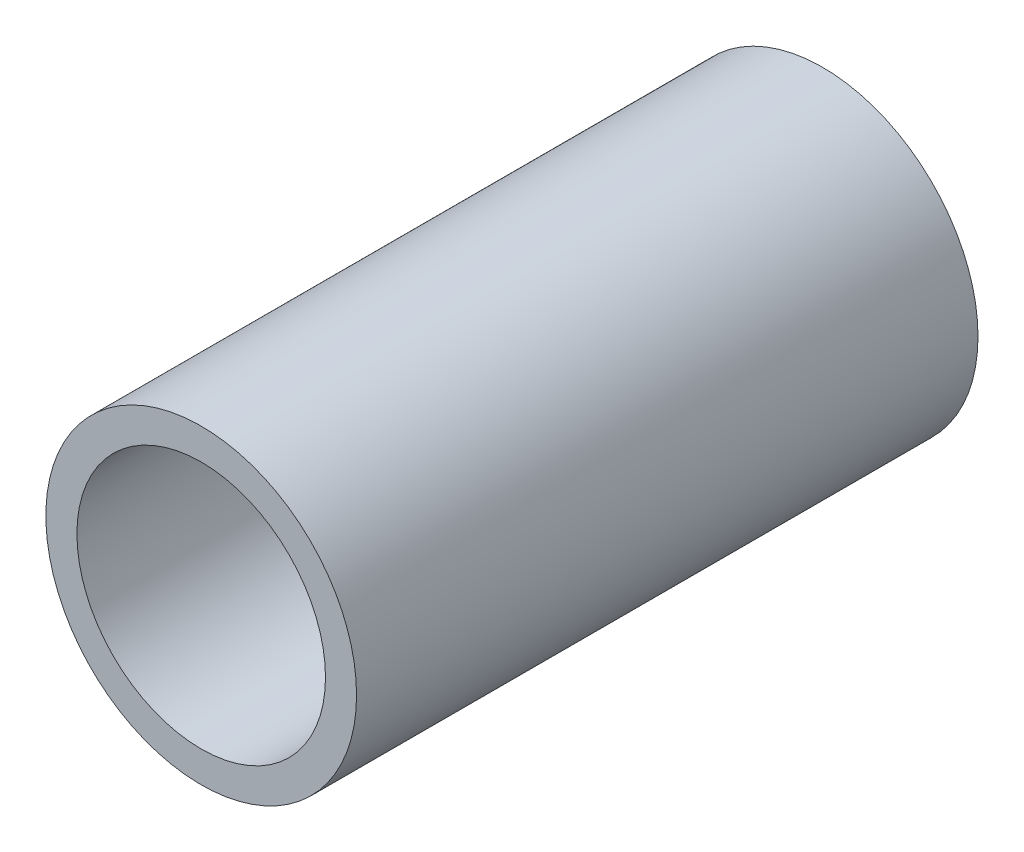
ISO-10303-21;
HEADER;
FILE_DESCRIPTION(('STEP AP214'),'2;1');
FILE_NAME('part.step','',(''),(''),'','','');
FILE_SCHEMA(('AUTOMOTIVE_DESIGN { 1 0 10303 214 1 1 1 1 }'));
ENDSEC;
DATA;
#1=APPLICATION_CONTEXT('core data for automotive mechanical design processes');
#2=APPLICATION_PROTOCOL_DEFINITION('international standard','automotive_design',2000,#1);
#3=PRODUCT_CONTEXT('',#1,'mechanical');
#4=PRODUCT('Part','Part','',(#3));
#5=PRODUCT_RELATED_PRODUCT_CATEGORY('part','',(#4));
#6=PRODUCT_DEFINITION_FORMATION('','',#4);
#7=PRODUCT_DEFINITION_CONTEXT('part definition',#1,'design');
#8=PRODUCT_DEFINITION('design','',#6,#7);
#9=PRODUCT_DEFINITION_SHAPE('','',#8);
#10=(LENGTH_UNIT() NAMED_UNIT(*) SI_UNIT(.MILLI.,.METRE.));
#11=(NAMED_UNIT(*) PLANE_ANGLE_UNIT() SI_UNIT($,.RADIAN.));
#12=(NAMED_UNIT(*) SI_UNIT($,.STERADIAN.) SOLID_ANGLE_UNIT());
#13=UNCERTAINTY_MEASURE_WITH_UNIT(LENGTH_MEASURE(1.E-05),#10,'distance_accuracy_value','');
#14=(GEOMETRIC_REPRESENTATION_CONTEXT(3) GLOBAL_UNCERTAINTY_ASSIGNED_CONTEXT((#13)) GLOBAL_UNIT_ASSIGNED_CONTEXT((#10,
#11,#12)) REPRESENTATION_CONTEXT('',''));
#15=CARTESIAN_POINT('',(0.,0.,0.));
#16=DIRECTION('',(0.,0.,1.));
#17=DIRECTION('',(1.,0.,0.));
#18=AXIS2_PLACEMENT_3D('',#15,#16,#17);
#19=CARTESIAN_POINT('',(0.,0.,31.75));
#20=DIRECTION('',(0.,0.,1.));
#21=DIRECTION('',(1.,0.,0.));
#22=AXIS2_PLACEMENT_3D('',#19,#20,#21);
#23=PLANE('',#22);
#24=CARTESIAN_POINT('',(0.,0.,31.75));
#25=DIRECTION('',(0.,0.,1.));
#26=DIRECTION('',(1.,0.,0.));
#27=AXIS2_PLACEMENT_3D('',#24,#25,#26);
#28=CIRCLE('',#27,7.9375);
#29=CARTESIAN_POINT('',(7.9375,0.,31.75));
#30=VERTEX_POINT('',#29);
#31=EDGE_CURVE('E10',#30,#30,#28,.T.);
#32=ORIENTED_EDGE('',*,*,#31,.T.);
#33=EDGE_LOOP('',(#32));
#34=FACE_BOUND('',#33,.T.);
#35=CARTESIAN_POINT('',(0.,0.,31.75));
#36=DIRECTION('',(0.,0.,1.));
#37=DIRECTION('',(1.,0.,0.));
#38=AXIS2_PLACEMENT_3D('',#35,#36,#37);
#39=CIRCLE('',#38,6.35);
#40=CARTESIAN_POINT('',(6.35,0.,31.75));
#41=VERTEX_POINT('',#40);
#42=EDGE_CURVE('E43',#41,#41,#39,.T.);
#43=ORIENTED_EDGE('',*,*,#42,.F.);
#44=EDGE_LOOP('',(#43));
#45=FACE_BOUND('',#44,.T.);
#46=ADVANCED_FACE('F32',(#34,#45),#23,.T.);
#47=CARTESIAN_POINT('',(0.,0.,0.));
#48=DIRECTION('',(0.,0.,1.));
#49=DIRECTION('',(1.,0.,0.));
#50=AXIS2_PLACEMENT_3D('',#47,#48,#49);
#51=PLANE('',#50);
#52=CARTESIAN_POINT('',(0.,0.,0.));
#53=DIRECTION('',(0.,0.,1.));
#54=DIRECTION('',(1.,0.,0.));
#55=AXIS2_PLACEMENT_3D('',#52,#53,#54);
#56=CIRCLE('',#55,7.9375);
#57=CARTESIAN_POINT('',(7.9375,0.,0.));
#58=VERTEX_POINT('',#57);
#59=EDGE_CURVE('E36',#58,#58,#56,.T.);
#60=ORIENTED_EDGE('',*,*,#59,.F.);
#61=EDGE_LOOP('',(#60));
#62=FACE_BOUND('',#61,.T.);
#63=CARTESIAN_POINT('',(0.,0.,0.));
#64=DIRECTION('',(0.,0.,1.));
#65=DIRECTION('',(1.,0.,0.));
#66=AXIS2_PLACEMENT_3D('',#63,#64,#65);
#67=CIRCLE('',#66,6.35);
#68=CARTESIAN_POINT('',(6.35,0.,0.));
#69=VERTEX_POINT('',#68);
#70=EDGE_CURVE('E45',#69,#69,#67,.T.);
#71=ORIENTED_EDGE('',*,*,#70,.T.);
#72=EDGE_LOOP('',(#71));
#73=FACE_BOUND('',#72,.T.);
#74=ADVANCED_FACE('F55',(#62,#73),#51,.F.);
#75=CARTESIAN_POINT('',(0.,0.,31.75));
#76=DIRECTION('',(0.,0.,-1.));
#77=DIRECTION('',(-1.,0.,0.));
#78=AXIS2_PLACEMENT_3D('',#75,#76,#77);
#79=CYLINDRICAL_SURFACE('',#78,7.9375);
#80=ORIENTED_EDGE('',*,*,#31,.F.);
#81=EDGE_LOOP('',(#80));
#82=FACE_BOUND('',#81,.T.);
#83=ORIENTED_EDGE('',*,*,#59,.T.);
#84=EDGE_LOOP('',(#83));
#85=FACE_BOUND('',#84,.T.);
#86=ADVANCED_FACE('F34',(#82,#85),#79,.T.);
#87=CARTESIAN_POINT('',(0.,0.,31.75));
#88=DIRECTION('',(0.,0.,-1.));
#89=DIRECTION('',(-1.,0.,0.));
#90=AXIS2_PLACEMENT_3D('',#87,#88,#89);
#91=CYLINDRICAL_SURFACE('',#90,6.35);
#92=ORIENTED_EDGE('',*,*,#42,.T.);
#93=EDGE_LOOP('',(#92));
#94=FACE_BOUND('',#93,.T.);
#95=ORIENTED_EDGE('',*,*,#70,.F.);
#96=EDGE_LOOP('',(#95));
#97=FACE_BOUND('',#96,.T.);
#98=ADVANCED_FACE('F51',(#94,#97),#91,.F.);
#99=CLOSED_SHELL('',(#46,#74,#86,#98));
#100=MANIFOLD_SOLID_BREP('B2',#99);
#101=ADVANCED_BREP_SHAPE_REPRESENTATION('',(#18,#100),#14);
#102=SHAPE_DEFINITION_REPRESENTATION(#9,#101);
ENDSEC;
END-ISO-10303-21;
